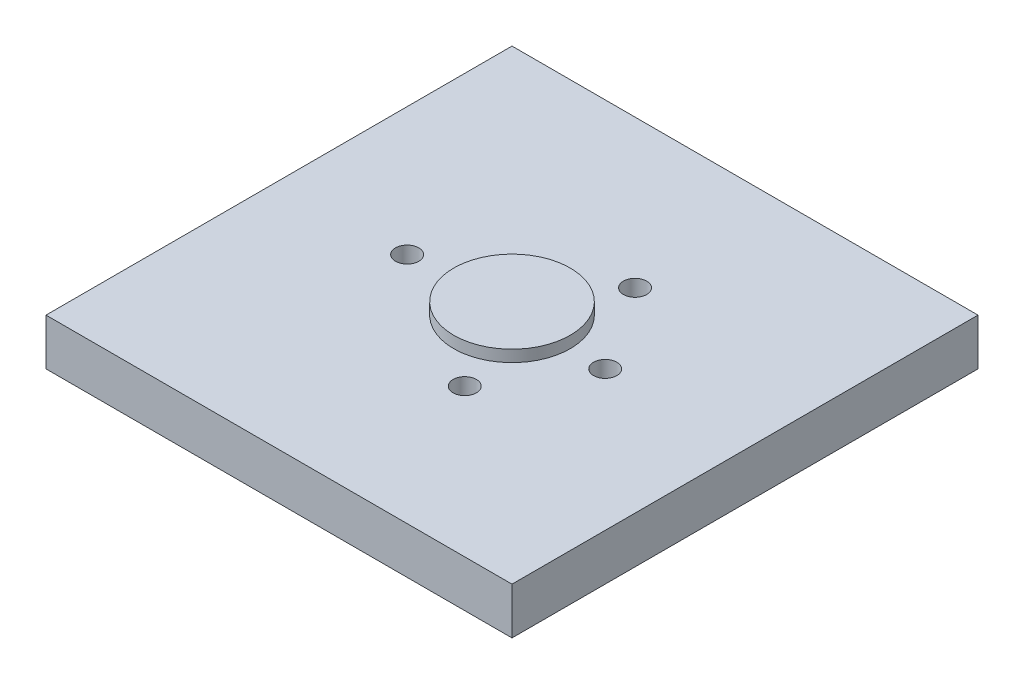
ISO-10303-21;
HEADER;
FILE_DESCRIPTION(('STEP AP214'),'2;1');
FILE_NAME('part.step','',(''),(''),'','','');
FILE_SCHEMA(('AUTOMOTIVE_DESIGN { 1 0 10303 214 1 1 1 1 }'));
ENDSEC;
DATA;
#1=APPLICATION_CONTEXT('core data for automotive mechanical design processes');
#2=APPLICATION_PROTOCOL_DEFINITION('international standard','automotive_design',2000,#1);
#3=PRODUCT_CONTEXT('',#1,'mechanical');
#4=PRODUCT('Part','Part','',(#3));
#5=PRODUCT_RELATED_PRODUCT_CATEGORY('part','',(#4));
#6=PRODUCT_DEFINITION_FORMATION('','',#4);
#7=PRODUCT_DEFINITION_CONTEXT('part definition',#1,'design');
#8=PRODUCT_DEFINITION('design','',#6,#7);
#9=PRODUCT_DEFINITION_SHAPE('','',#8);
#10=(LENGTH_UNIT() NAMED_UNIT(*) SI_UNIT(.MILLI.,.METRE.));
#11=(NAMED_UNIT(*) PLANE_ANGLE_UNIT() SI_UNIT($,.RADIAN.));
#12=(NAMED_UNIT(*) SI_UNIT($,.STERADIAN.) SOLID_ANGLE_UNIT());
#13=UNCERTAINTY_MEASURE_WITH_UNIT(LENGTH_MEASURE(1.E-05),#10,'distance_accuracy_value','');
#14=(GEOMETRIC_REPRESENTATION_CONTEXT(3) GLOBAL_UNCERTAINTY_ASSIGNED_CONTEXT((#13)) GLOBAL_UNIT_ASSIGNED_CONTEXT((#10,
#11,#12)) REPRESENTATION_CONTEXT('',''));
#15=CARTESIAN_POINT('',(0.,0.,0.));
#16=DIRECTION('',(0.,0.,1.));
#17=DIRECTION('',(1.,0.,0.));
#18=AXIS2_PLACEMENT_3D('',#15,#16,#17);
#19=CARTESIAN_POINT('',(0.,12.7,0.));
#20=DIRECTION('',(0.,1.,0.));
#21=DIRECTION('',(0.,0.,1.));
#22=AXIS2_PLACEMENT_3D('',#19,#20,#21);
#23=PLANE('',#22);
#24=CARTESIAN_POINT('',(-28.575,12.7,0.));
#25=DIRECTION('',(0.,1.,0.));
#26=DIRECTION('',(0.,0.,1.));
#27=AXIS2_PLACEMENT_3D('',#24,#25,#26);
#28=CIRCLE('',#27,3.17499999999999);
#29=CARTESIAN_POINT('',(-28.575,12.7,3.17499999999999));
#30=VERTEX_POINT('',#29);
#31=EDGE_CURVE('E136',#30,#30,#28,.T.);
#32=ORIENTED_EDGE('',*,*,#31,.F.);
#33=EDGE_LOOP('',(#32));
#34=FACE_BOUND('',#33,.T.);
#35=CARTESIAN_POINT('',(10.3311107341253,12.7,-23.2040546241221));
#36=DIRECTION('',(0.,1.,0.));
#37=DIRECTION('',(0.,0.,1.));
#38=AXIS2_PLACEMENT_3D('',#35,#36,#37);
#39=CIRCLE('',#38,3.17499999999999);
#40=CARTESIAN_POINT('',(10.3311107341253,12.7,-20.0290546241221));
#41=VERTEX_POINT('',#40);
#42=EDGE_CURVE('E130',#41,#41,#39,.T.);
#43=ORIENTED_EDGE('',*,*,#42,.F.);
#44=EDGE_LOOP('',(#43));
#45=FACE_BOUND('',#44,.T.);
#46=CARTESIAN_POINT('',(25.4,12.7,0.));
#47=DIRECTION('',(0.,1.,0.));
#48=DIRECTION('',(0.,0.,1.));
#49=AXIS2_PLACEMENT_3D('',#46,#47,#48);
#50=CIRCLE('',#49,3.17499999999999);
#51=CARTESIAN_POINT('',(25.4,12.7,3.17499999999999));
#52=VERTEX_POINT('',#51);
#53=EDGE_CURVE('E124',#52,#52,#50,.T.);
#54=ORIENTED_EDGE('',*,*,#53,.F.);
#55=EDGE_LOOP('',(#54));
#56=FACE_BOUND('',#55,.T.);
#57=CARTESIAN_POINT('',(10.3311107341253,12.7,23.2040546241221));
#58=DIRECTION('',(0.,1.,0.));
#59=DIRECTION('',(0.,0.,1.));
#60=AXIS2_PLACEMENT_3D('',#57,#58,#59);
#61=CIRCLE('',#60,3.17499999999999);
#62=CARTESIAN_POINT('',(10.3311107341253,12.7,26.3790546241221));
#63=VERTEX_POINT('',#62);
#64=EDGE_CURVE('E118',#63,#63,#61,.T.);
#65=ORIENTED_EDGE('',*,*,#64,.F.);
#66=EDGE_LOOP('',(#65));
#67=FACE_BOUND('',#66,.T.);
#68=DIRECTION('',(0.,0.,-1.));
#69=VECTOR('',#68,1.);
#70=CARTESIAN_POINT('',(63.5,12.7,-63.5));
#71=LINE('',#70,#69);
#72=CARTESIAN_POINT('',(63.5,12.7,63.5));
#73=VERTEX_POINT('',#72);
#74=CARTESIAN_POINT('',(63.5,12.7,-63.5));
#75=VERTEX_POINT('',#74);
#76=EDGE_CURVE('E84',#73,#75,#71,.T.);
#77=ORIENTED_EDGE('',*,*,#76,.T.);
#78=DIRECTION('',(-1.,0.,0.));
#79=VECTOR('',#78,1.);
#80=CARTESIAN_POINT('',(-63.5,12.7,-63.5));
#81=LINE('',#80,#79);
#82=CARTESIAN_POINT('',(-63.5,12.7,-63.5));
#83=VERTEX_POINT('',#82);
#84=EDGE_CURVE('E79',#75,#83,#81,.T.);
#85=ORIENTED_EDGE('',*,*,#84,.T.);
#86=DIRECTION('',(0.,0.,1.));
#87=VECTOR('',#86,1.);
#88=CARTESIAN_POINT('',(-63.5,12.7,-63.5));
#89=LINE('',#88,#87);
#90=CARTESIAN_POINT('',(-63.5,12.7,63.5));
#91=VERTEX_POINT('',#90);
#92=EDGE_CURVE('E82',#83,#91,#89,.T.);
#93=ORIENTED_EDGE('',*,*,#92,.T.);
#94=DIRECTION('',(1.,0.,0.));
#95=VECTOR('',#94,1.);
#96=CARTESIAN_POINT('',(-63.5,12.7,63.5));
#97=LINE('',#96,#95);
#98=EDGE_CURVE('E49',#91,#73,#97,.T.);
#99=ORIENTED_EDGE('',*,*,#98,.T.);
#100=EDGE_LOOP('',(#77,#85,#93,#99));
#101=FACE_BOUND('',#100,.T.);
#102=CARTESIAN_POINT('',(0.,12.7,0.));
#103=DIRECTION('',(0.,1.,0.));
#104=DIRECTION('',(0.,0.,1.));
#105=AXIS2_PLACEMENT_3D('',#102,#103,#104);
#106=CIRCLE('',#105,15.875);
#107=CARTESIAN_POINT('',(0.,12.7,15.875));
#108=VERTEX_POINT('',#107);
#109=EDGE_CURVE('E110',#108,#108,#106,.T.);
#110=ORIENTED_EDGE('',*,*,#109,.F.);
#111=EDGE_LOOP('',(#110));
#112=FACE_BOUND('',#111,.T.);
#113=ADVANCED_FACE('F32',(#34,#45,#56,#67,#101,#112),#23,.T.);
#114=CARTESIAN_POINT('',(63.5,12.7,-63.5));
#115=DIRECTION('',(-1.,0.,0.));
#116=DIRECTION('',(0.,0.,1.));
#117=AXIS2_PLACEMENT_3D('',#114,#115,#116);
#118=PLANE('',#117);
#119=DIRECTION('',(0.,0.,-1.));
#120=VECTOR('',#119,1.);
#121=CARTESIAN_POINT('',(63.5,0.,-63.5));
#122=LINE('',#121,#120);
#123=CARTESIAN_POINT('',(63.5,0.,63.5));
#124=VERTEX_POINT('',#123);
#125=CARTESIAN_POINT('',(63.5,0.,-63.5));
#126=VERTEX_POINT('',#125);
#127=EDGE_CURVE('E96',#124,#126,#122,.T.);
#128=ORIENTED_EDGE('',*,*,#127,.T.);
#129=DIRECTION('',(0.,-1.,0.));
#130=VECTOR('',#129,1.);
#131=CARTESIAN_POINT('',(63.5,12.7,-63.5));
#132=LINE('',#131,#130);
#133=EDGE_CURVE('E11',#75,#126,#132,.T.);
#134=ORIENTED_EDGE('',*,*,#133,.F.);
#135=ORIENTED_EDGE('',*,*,#76,.F.);
#136=DIRECTION('',(0.,-1.,0.));
#137=VECTOR('',#136,1.);
#138=CARTESIAN_POINT('',(63.5,12.7,63.5));
#139=LINE('',#138,#137);
#140=EDGE_CURVE('E92',#73,#124,#139,.T.);
#141=ORIENTED_EDGE('',*,*,#140,.T.);
#142=EDGE_LOOP('',(#128,#134,#135,#141));
#143=FACE_BOUND('',#142,.T.);
#144=ADVANCED_FACE('F34',(#143),#118,.F.);
#145=CARTESIAN_POINT('',(-63.5,12.7,-63.5));
#146=DIRECTION('',(0.,0.,1.));
#147=DIRECTION('',(1.,0.,0.));
#148=AXIS2_PLACEMENT_3D('',#145,#146,#147);
#149=PLANE('',#148);
#150=DIRECTION('',(-1.,0.,0.));
#151=VECTOR('',#150,1.);
#152=CARTESIAN_POINT('',(-63.5,0.,-63.5));
#153=LINE('',#152,#151);
#154=CARTESIAN_POINT('',(-63.5,0.,-63.5));
#155=VERTEX_POINT('',#154);
#156=EDGE_CURVE('E88',#126,#155,#153,.T.);
#157=ORIENTED_EDGE('',*,*,#156,.T.);
#158=DIRECTION('',(0.,-1.,0.));
#159=VECTOR('',#158,1.);
#160=CARTESIAN_POINT('',(-63.5,12.7,-63.5));
#161=LINE('',#160,#159);
#162=EDGE_CURVE('E41',#83,#155,#161,.T.);
#163=ORIENTED_EDGE('',*,*,#162,.F.);
#164=ORIENTED_EDGE('',*,*,#84,.F.);
#165=ORIENTED_EDGE('',*,*,#133,.T.);
#166=EDGE_LOOP('',(#157,#163,#164,#165));
#167=FACE_BOUND('',#166,.T.);
#168=ADVANCED_FACE('F87',(#167),#149,.F.);
#169=CARTESIAN_POINT('',(-63.5,12.7,-63.5));
#170=DIRECTION('',(1.,0.,0.));
#171=DIRECTION('',(0.,0.,-1.));
#172=AXIS2_PLACEMENT_3D('',#169,#170,#171);
#173=PLANE('',#172);
#174=DIRECTION('',(0.,0.,1.));
#175=VECTOR('',#174,1.);
#176=CARTESIAN_POINT('',(-63.5,0.,-63.5));
#177=LINE('',#176,#175);
#178=CARTESIAN_POINT('',(-63.5,0.,63.5));
#179=VERTEX_POINT('',#178);
#180=EDGE_CURVE('E66',#155,#179,#177,.T.);
#181=ORIENTED_EDGE('',*,*,#180,.T.);
#182=DIRECTION('',(0.,-1.,0.));
#183=VECTOR('',#182,1.);
#184=CARTESIAN_POINT('',(-63.5,12.7,63.5));
#185=LINE('',#184,#183);
#186=EDGE_CURVE('E89',#91,#179,#185,.T.);
#187=ORIENTED_EDGE('',*,*,#186,.F.);
#188=ORIENTED_EDGE('',*,*,#92,.F.);
#189=ORIENTED_EDGE('',*,*,#162,.T.);
#190=EDGE_LOOP('',(#181,#187,#188,#189));
#191=FACE_BOUND('',#190,.T.);
#192=ADVANCED_FACE('F90',(#191),#173,.F.);
#193=CARTESIAN_POINT('',(-63.5,12.7,63.5));
#194=DIRECTION('',(0.,0.,-1.));
#195=DIRECTION('',(-1.,0.,0.));
#196=AXIS2_PLACEMENT_3D('',#193,#194,#195);
#197=PLANE('',#196);
#198=DIRECTION('',(1.,0.,0.));
#199=VECTOR('',#198,1.);
#200=CARTESIAN_POINT('',(-63.5,0.,63.5));
#201=LINE('',#200,#199);
#202=EDGE_CURVE('E72',#179,#124,#201,.T.);
#203=ORIENTED_EDGE('',*,*,#202,.T.);
#204=ORIENTED_EDGE('',*,*,#140,.F.);
#205=ORIENTED_EDGE('',*,*,#98,.F.);
#206=ORIENTED_EDGE('',*,*,#186,.T.);
#207=EDGE_LOOP('',(#203,#204,#205,#206));
#208=FACE_BOUND('',#207,.T.);
#209=ADVANCED_FACE('F104',(#208),#197,.F.);
#210=CARTESIAN_POINT('',(0.,0.,0.));
#211=DIRECTION('',(0.,1.,0.));
#212=DIRECTION('',(0.,0.,1.));
#213=AXIS2_PLACEMENT_3D('',#210,#211,#212);
#214=PLANE('',#213);
#215=CARTESIAN_POINT('',(-28.575,0.,0.));
#216=DIRECTION('',(0.,1.,0.));
#217=DIRECTION('',(0.,0.,1.));
#218=AXIS2_PLACEMENT_3D('',#215,#216,#217);
#219=CIRCLE('',#218,3.17499999999999);
#220=CARTESIAN_POINT('',(-28.575,0.,3.175));
#221=VERTEX_POINT('',#220);
#222=EDGE_CURVE('E133',#221,#221,#219,.T.);
#223=ORIENTED_EDGE('',*,*,#222,.T.);
#224=EDGE_LOOP('',(#223));
#225=FACE_BOUND('',#224,.T.);
#226=CARTESIAN_POINT('',(10.3311107341253,0.,-23.2040546241221));
#227=DIRECTION('',(0.,1.,0.));
#228=DIRECTION('',(0.,0.,1.));
#229=AXIS2_PLACEMENT_3D('',#226,#227,#228);
#230=CIRCLE('',#229,3.17499999999999);
#231=CARTESIAN_POINT('',(10.3311107341253,0.,-20.0290546241221));
#232=VERTEX_POINT('',#231);
#233=EDGE_CURVE('E127',#232,#232,#230,.T.);
#234=ORIENTED_EDGE('',*,*,#233,.T.);
#235=EDGE_LOOP('',(#234));
#236=FACE_BOUND('',#235,.T.);
#237=CARTESIAN_POINT('',(25.4,0.,0.));
#238=DIRECTION('',(0.,1.,0.));
#239=DIRECTION('',(0.,0.,1.));
#240=AXIS2_PLACEMENT_3D('',#237,#238,#239);
#241=CIRCLE('',#240,3.17499999999999);
#242=CARTESIAN_POINT('',(25.4,0.,3.17499999999999));
#243=VERTEX_POINT('',#242);
#244=EDGE_CURVE('E121',#243,#243,#241,.T.);
#245=ORIENTED_EDGE('',*,*,#244,.T.);
#246=EDGE_LOOP('',(#245));
#247=FACE_BOUND('',#246,.T.);
#248=CARTESIAN_POINT('',(10.3311107341253,0.,23.2040546241221));
#249=DIRECTION('',(0.,1.,0.));
#250=DIRECTION('',(0.,0.,1.));
#251=AXIS2_PLACEMENT_3D('',#248,#249,#250);
#252=CIRCLE('',#251,3.17499999999999);
#253=CARTESIAN_POINT('',(10.3311107341253,0.,26.3790546241221));
#254=VERTEX_POINT('',#253);
#255=EDGE_CURVE('E113',#254,#254,#252,.T.);
#256=ORIENTED_EDGE('',*,*,#255,.T.);
#257=EDGE_LOOP('',(#256));
#258=FACE_BOUND('',#257,.T.);
#259=ORIENTED_EDGE('',*,*,#127,.F.);
#260=ORIENTED_EDGE('',*,*,#202,.F.);
#261=ORIENTED_EDGE('',*,*,#180,.F.);
#262=ORIENTED_EDGE('',*,*,#156,.F.);
#263=EDGE_LOOP('',(#259,#260,#261,#262));
#264=FACE_BOUND('',#263,.T.);
#265=ADVANCED_FACE('F107',(#225,#236,#247,#258,#264),#214,.F.);
#266=CARTESIAN_POINT('',(0.,15.875,0.));
#267=DIRECTION('',(0.,-1.,0.));
#268=DIRECTION('',(0.,0.,-1.));
#269=AXIS2_PLACEMENT_3D('',#266,#267,#268);
#270=CYLINDRICAL_SURFACE('',#269,15.875);
#271=CARTESIAN_POINT('',(0.,15.875,0.));
#272=DIRECTION('',(0.,1.,0.));
#273=DIRECTION('',(0.,0.,1.));
#274=AXIS2_PLACEMENT_3D('',#271,#272,#273);
#275=CIRCLE('',#274,15.875);
#276=CARTESIAN_POINT('',(0.,15.875,15.875));
#277=VERTEX_POINT('',#276);
#278=EDGE_CURVE('E99',#277,#277,#275,.T.);
#279=ORIENTED_EDGE('',*,*,#278,.F.);
#280=EDGE_LOOP('',(#279));
#281=FACE_BOUND('',#280,.T.);
#282=ORIENTED_EDGE('',*,*,#109,.T.);
#283=EDGE_LOOP('',(#282));
#284=FACE_BOUND('',#283,.T.);
#285=ADVANCED_FACE('F164',(#281,#284),#270,.T.);
#286=CARTESIAN_POINT('',(0.,15.875,0.));
#287=DIRECTION('',(0.,1.,0.));
#288=DIRECTION('',(0.,0.,1.));
#289=AXIS2_PLACEMENT_3D('',#286,#287,#288);
#290=PLANE('',#289);
#291=ORIENTED_EDGE('',*,*,#278,.T.);
#292=EDGE_LOOP('',(#291));
#293=FACE_BOUND('',#292,.T.);
#294=ADVANCED_FACE('F154',(#293),#290,.T.);
#295=CARTESIAN_POINT('',(10.3311107341253,12.7,23.2040546241221));
#296=DIRECTION('',(0.,1.,0.));
#297=DIRECTION('',(0.,0.,1.));
#298=AXIS2_PLACEMENT_3D('',#295,#296,#297);
#299=CYLINDRICAL_SURFACE('',#298,3.17499999999999);
#300=ORIENTED_EDGE('',*,*,#255,.F.);
#301=EDGE_LOOP('',(#300));
#302=FACE_BOUND('',#301,.T.);
#303=ORIENTED_EDGE('',*,*,#64,.T.);
#304=EDGE_LOOP('',(#303));
#305=FACE_BOUND('',#304,.T.);
#306=ADVANCED_FACE('F151',(#302,#305),#299,.F.);
#307=CARTESIAN_POINT('',(25.4,12.7,0.));
#308=DIRECTION('',(0.,1.,0.));
#309=DIRECTION('',(0.,0.,1.));
#310=AXIS2_PLACEMENT_3D('',#307,#308,#309);
#311=CYLINDRICAL_SURFACE('',#310,3.17499999999999);
#312=ORIENTED_EDGE('',*,*,#244,.F.);
#313=EDGE_LOOP('',(#312));
#314=FACE_BOUND('',#313,.T.);
#315=ORIENTED_EDGE('',*,*,#53,.T.);
#316=EDGE_LOOP('',(#315));
#317=FACE_BOUND('',#316,.T.);
#318=ADVANCED_FACE('F153',(#314,#317),#311,.F.);
#319=CARTESIAN_POINT('',(10.3311107341253,12.7,-23.2040546241221));
#320=DIRECTION('',(0.,1.,0.));
#321=DIRECTION('',(0.,0.,1.));
#322=AXIS2_PLACEMENT_3D('',#319,#320,#321);
#323=CYLINDRICAL_SURFACE('',#322,3.17499999999999);
#324=ORIENTED_EDGE('',*,*,#233,.F.);
#325=EDGE_LOOP('',(#324));
#326=FACE_BOUND('',#325,.T.);
#327=ORIENTED_EDGE('',*,*,#42,.T.);
#328=EDGE_LOOP('',(#327));
#329=FACE_BOUND('',#328,.T.);
#330=ADVANCED_FACE('F161',(#326,#329),#323,.F.);
#331=CARTESIAN_POINT('',(-28.575,12.7,0.));
#332=DIRECTION('',(0.,1.,0.));
#333=DIRECTION('',(0.,0.,1.));
#334=AXIS2_PLACEMENT_3D('',#331,#332,#333);
#335=CYLINDRICAL_SURFACE('',#334,3.17499999999999);
#336=ORIENTED_EDGE('',*,*,#222,.F.);
#337=EDGE_LOOP('',(#336));
#338=FACE_BOUND('',#337,.T.);
#339=ORIENTED_EDGE('',*,*,#31,.T.);
#340=EDGE_LOOP('',(#339));
#341=FACE_BOUND('',#340,.T.);
#342=ADVANCED_FACE('F140',(#338,#341),#335,.F.);
#343=CLOSED_SHELL('',(#113,#144,#168,#192,#209,#265,#285,#294,#306,#318,#330,#342));
#344=MANIFOLD_SOLID_BREP('B2',#343);
#345=ADVANCED_BREP_SHAPE_REPRESENTATION('',(#18,#344),#14);
#346=SHAPE_DEFINITION_REPRESENTATION(#9,#345);
ENDSEC;
END-ISO-10303-21;
